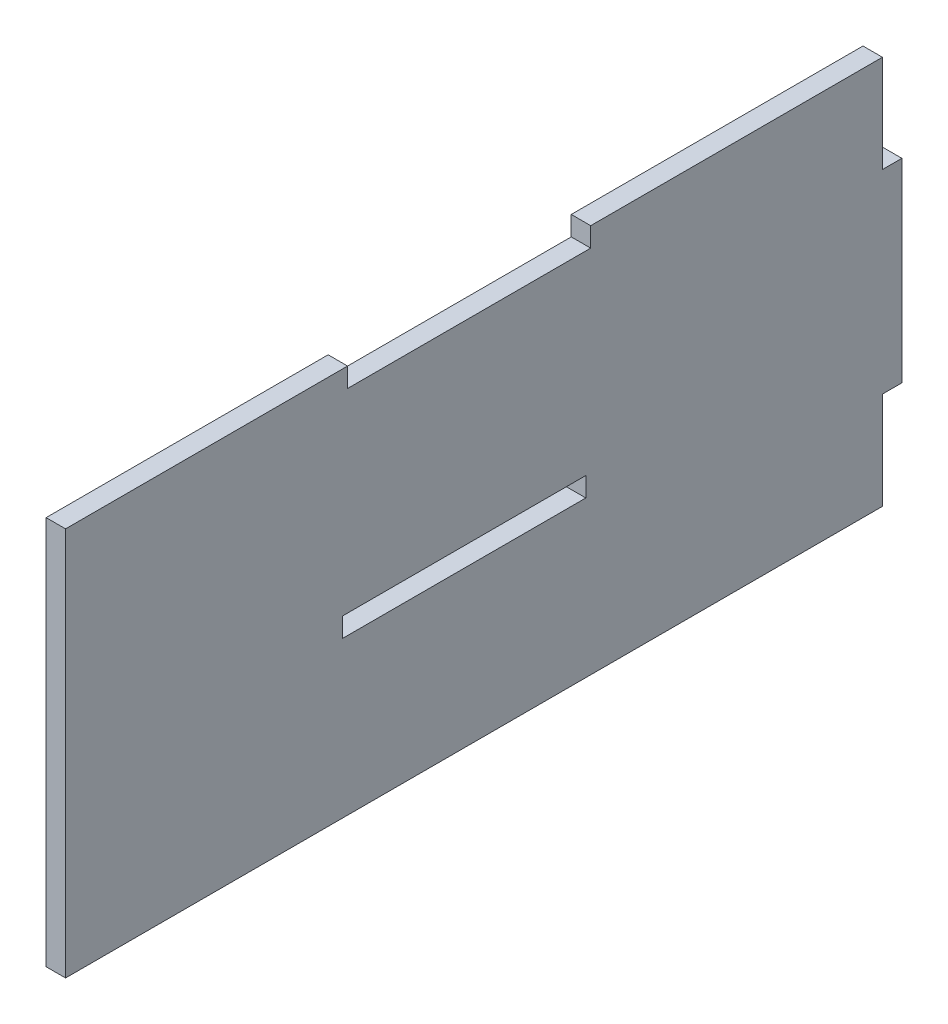
ISO-10303-21;
HEADER;
FILE_DESCRIPTION(('STEP AP214'),'2;1');
FILE_NAME('part.step','',(''),(''),'','','');
FILE_SCHEMA(('AUTOMOTIVE_DESIGN { 1 0 10303 214 1 1 1 1 }'));
ENDSEC;
DATA;
#1=APPLICATION_CONTEXT('core data for automotive mechanical design processes');
#2=APPLICATION_PROTOCOL_DEFINITION('international standard','automotive_design',2000,#1);
#3=PRODUCT_CONTEXT('',#1,'mechanical');
#4=PRODUCT('Part','Part','',(#3));
#5=PRODUCT_RELATED_PRODUCT_CATEGORY('part','',(#4));
#6=PRODUCT_DEFINITION_FORMATION('','',#4);
#7=PRODUCT_DEFINITION_CONTEXT('part definition',#1,'design');
#8=PRODUCT_DEFINITION('design','',#6,#7);
#9=PRODUCT_DEFINITION_SHAPE('','',#8);
#10=(LENGTH_UNIT() NAMED_UNIT(*) SI_UNIT(.MILLI.,.METRE.));
#11=(NAMED_UNIT(*) PLANE_ANGLE_UNIT() SI_UNIT($,.RADIAN.));
#12=(NAMED_UNIT(*) SI_UNIT($,.STERADIAN.) SOLID_ANGLE_UNIT());
#13=UNCERTAINTY_MEASURE_WITH_UNIT(LENGTH_MEASURE(1.E-05),#10,'distance_accuracy_value','');
#14=(GEOMETRIC_REPRESENTATION_CONTEXT(3) GLOBAL_UNCERTAINTY_ASSIGNED_CONTEXT((#13)) GLOBAL_UNIT_ASSIGNED_CONTEXT((#10,
#11,#12)) REPRESENTATION_CONTEXT('',''));
#15=CARTESIAN_POINT('',(0.,0.,0.));
#16=DIRECTION('',(0.,0.,1.));
#17=DIRECTION('',(1.,0.,0.));
#18=AXIS2_PLACEMENT_3D('',#15,#16,#17);
#19=CARTESIAN_POINT('',(4.,40.,87.));
#20=DIRECTION('',(0.,-1.,0.));
#21=DIRECTION('',(0.,0.,-1.));
#22=AXIS2_PLACEMENT_3D('',#19,#20,#21);
#23=PLANE('',#22);
#24=DIRECTION('',(0.,0.,1.));
#25=VECTOR('',#24,1.);
#26=CARTESIAN_POINT('',(0.,40.,87.));
#27=LINE('',#26,#25);
#28=CARTESIAN_POINT('',(0.,40.,27.));
#29=VERTEX_POINT('',#28);
#30=CARTESIAN_POINT('',(0.,40.,85.));
#31=VERTEX_POINT('',#30);
#32=EDGE_CURVE('E274',#29,#31,#27,.T.);
#33=ORIENTED_EDGE('',*,*,#32,.T.);
#34=DIRECTION('',(1.,0.,0.));
#35=VECTOR('',#34,1.);
#36=CARTESIAN_POINT('',(-6.,40.,85.));
#37=LINE('',#36,#35);
#38=CARTESIAN_POINT('',(4.,40.,85.));
#39=VERTEX_POINT('',#38);
#40=EDGE_CURVE('E195',#31,#39,#37,.T.);
#41=ORIENTED_EDGE('',*,*,#40,.T.);
#42=DIRECTION('',(0.,0.,1.));
#43=VECTOR('',#42,1.);
#44=CARTESIAN_POINT('',(4.,40.,87.));
#45=LINE('',#44,#43);
#46=CARTESIAN_POINT('',(4.,40.,27.));
#47=VERTEX_POINT('',#46);
#48=EDGE_CURVE('E266',#47,#39,#45,.T.);
#49=ORIENTED_EDGE('',*,*,#48,.F.);
#50=DIRECTION('',(1.,0.,0.));
#51=VECTOR('',#50,1.);
#52=CARTESIAN_POINT('',(0.,40.,27.));
#53=LINE('',#52,#51);
#54=EDGE_CURVE('E217',#29,#47,#53,.T.);
#55=ORIENTED_EDGE('',*,*,#54,.F.);
#56=EDGE_LOOP('',(#33,#41,#49,#55));
#57=FACE_BOUND('',#56,.T.);
#58=ADVANCED_FACE('F43',(#57),#23,.F.);
#59=CARTESIAN_POINT('',(4.,40.,-87.));
#60=DIRECTION('',(0.,0.,1.));
#61=DIRECTION('',(1.,0.,0.));
#62=AXIS2_PLACEMENT_3D('',#59,#60,#61);
#63=PLANE('',#62);
#64=DIRECTION('',(0.,1.,0.));
#65=VECTOR('',#64,1.);
#66=CARTESIAN_POINT('',(0.,40.,-87.));
#67=LINE('',#66,#65);
#68=CARTESIAN_POINT('',(0.,-20.,-87.));
#69=VERTEX_POINT('',#68);
#70=CARTESIAN_POINT('',(0.,20.,-87.));
#71=VERTEX_POINT('',#70);
#72=EDGE_CURVE('E242',#69,#71,#67,.T.);
#73=ORIENTED_EDGE('',*,*,#72,.T.);
#74=DIRECTION('',(1.,0.,0.));
#75=VECTOR('',#74,1.);
#76=CARTESIAN_POINT('',(0.,20.,-87.));
#77=LINE('',#76,#75);
#78=CARTESIAN_POINT('',(4.,20.,-87.));
#79=VERTEX_POINT('',#78);
#80=EDGE_CURVE('E239',#71,#79,#77,.T.);
#81=ORIENTED_EDGE('',*,*,#80,.T.);
#82=DIRECTION('',(0.,1.,0.));
#83=VECTOR('',#82,1.);
#84=CARTESIAN_POINT('',(4.,40.,-87.));
#85=LINE('',#84,#83);
#86=CARTESIAN_POINT('',(4.,-20.,-87.));
#87=VERTEX_POINT('',#86);
#88=EDGE_CURVE('E263',#87,#79,#85,.T.);
#89=ORIENTED_EDGE('',*,*,#88,.F.);
#90=DIRECTION('',(1.,0.,0.));
#91=VECTOR('',#90,1.);
#92=CARTESIAN_POINT('',(0.,-20.,-87.));
#93=LINE('',#92,#91);
#94=EDGE_CURVE('E246',#69,#87,#93,.T.);
#95=ORIENTED_EDGE('',*,*,#94,.F.);
#96=EDGE_LOOP('',(#73,#81,#89,#95));
#97=FACE_BOUND('',#96,.T.);
#98=ADVANCED_FACE('F45',(#97),#63,.F.);
#99=CARTESIAN_POINT('',(0.,40.,-83.));
#100=VERTEX_POINT('',#99);
#101=CARTESIAN_POINT('',(0.,40.,-23.));
#102=VERTEX_POINT('',#101);
#103=EDGE_CURVE('E275',#100,#102,#27,.T.);
#104=ORIENTED_EDGE('',*,*,#103,.T.);
#105=DIRECTION('',(1.,0.,0.));
#106=VECTOR('',#105,1.);
#107=CARTESIAN_POINT('',(0.,40.,-23.));
#108=LINE('',#107,#106);
#109=CARTESIAN_POINT('',(4.,40.,-23.));
#110=VERTEX_POINT('',#109);
#111=EDGE_CURVE('E220',#102,#110,#108,.T.);
#112=ORIENTED_EDGE('',*,*,#111,.T.);
#113=CARTESIAN_POINT('',(4.,40.,-83.));
#114=VERTEX_POINT('',#113);
#115=EDGE_CURVE('E268',#114,#110,#45,.T.);
#116=ORIENTED_EDGE('',*,*,#115,.F.);
#117=DIRECTION('',(1.,0.,0.));
#118=VECTOR('',#117,1.);
#119=CARTESIAN_POINT('',(0.,40.,-83.));
#120=LINE('',#119,#118);
#121=EDGE_CURVE('E233',#100,#114,#120,.T.);
#122=ORIENTED_EDGE('',*,*,#121,.F.);
#123=EDGE_LOOP('',(#104,#112,#116,#122));
#124=FACE_BOUND('',#123,.T.);
#125=ADVANCED_FACE('F321',(#124),#23,.F.);
#126=CARTESIAN_POINT('',(4.,-40.,87.));
#127=DIRECTION('',(0.,1.,0.));
#128=DIRECTION('',(0.,0.,1.));
#129=AXIS2_PLACEMENT_3D('',#126,#127,#128);
#130=PLANE('',#129);
#131=DIRECTION('',(0.,0.,-1.));
#132=VECTOR('',#131,1.);
#133=CARTESIAN_POINT('',(4.,-40.,87.));
#134=LINE('',#133,#132);
#135=CARTESIAN_POINT('',(4.,-40.,85.));
#136=VERTEX_POINT('',#135);
#137=CARTESIAN_POINT('',(4.,-40.,-83.));
#138=VERTEX_POINT('',#137);
#139=EDGE_CURVE('E51',#136,#138,#134,.T.);
#140=ORIENTED_EDGE('',*,*,#139,.F.);
#141=DIRECTION('',(1.,0.,0.));
#142=VECTOR('',#141,1.);
#143=CARTESIAN_POINT('',(-6.,-40.,85.));
#144=LINE('',#143,#142);
#145=CARTESIAN_POINT('',(0.,-40.,85.));
#146=VERTEX_POINT('',#145);
#147=EDGE_CURVE('E194',#146,#136,#144,.T.);
#148=ORIENTED_EDGE('',*,*,#147,.F.);
#149=DIRECTION('',(0.,0.,-1.));
#150=VECTOR('',#149,1.);
#151=CARTESIAN_POINT('',(0.,-40.,87.));
#152=LINE('',#151,#150);
#153=CARTESIAN_POINT('',(0.,-40.,-83.));
#154=VERTEX_POINT('',#153);
#155=EDGE_CURVE('E267',#146,#154,#152,.T.);
#156=ORIENTED_EDGE('',*,*,#155,.T.);
#157=DIRECTION('',(1.,0.,0.));
#158=VECTOR('',#157,1.);
#159=CARTESIAN_POINT('',(0.,-40.,-83.));
#160=LINE('',#159,#158);
#161=EDGE_CURVE('E219',#154,#138,#160,.T.);
#162=ORIENTED_EDGE('',*,*,#161,.T.);
#163=EDGE_LOOP('',(#140,#148,#156,#162));
#164=FACE_BOUND('',#163,.T.);
#165=ADVANCED_FACE('F282',(#164),#130,.F.);
#166=CARTESIAN_POINT('',(4.,0.,0.));
#167=DIRECTION('',(1.,0.,0.));
#168=DIRECTION('',(0.,0.,-1.));
#169=AXIS2_PLACEMENT_3D('',#166,#167,#168);
#170=PLANE('',#169);
#171=DIRECTION('',(0.,-1.,0.));
#172=VECTOR('',#171,1.);
#173=CARTESIAN_POINT('',(4.,-4.,28.));
#174=LINE('',#173,#172);
#175=CARTESIAN_POINT('',(4.,-4.,28.));
#176=VERTEX_POINT('',#175);
#177=CARTESIAN_POINT('',(4.,-8.,28.));
#178=VERTEX_POINT('',#177);
#179=EDGE_CURVE('E58',#176,#178,#174,.T.);
#180=ORIENTED_EDGE('',*,*,#179,.F.);
#181=DIRECTION('',(0.,0.,1.));
#182=VECTOR('',#181,1.);
#183=CARTESIAN_POINT('',(4.,-4.,28.));
#184=LINE('',#183,#182);
#185=CARTESIAN_POINT('',(4.,-4.,-22.));
#186=VERTEX_POINT('',#185);
#187=EDGE_CURVE('E174',#186,#176,#184,.T.);
#188=ORIENTED_EDGE('',*,*,#187,.F.);
#189=DIRECTION('',(0.,1.,0.));
#190=VECTOR('',#189,1.);
#191=CARTESIAN_POINT('',(4.,-4.,-22.));
#192=LINE('',#191,#190);
#193=CARTESIAN_POINT('',(4.,-8.,-22.));
#194=VERTEX_POINT('',#193);
#195=EDGE_CURVE('E177',#194,#186,#192,.T.);
#196=ORIENTED_EDGE('',*,*,#195,.F.);
#197=DIRECTION('',(0.,0.,-1.));
#198=VECTOR('',#197,1.);
#199=CARTESIAN_POINT('',(4.,-8.,28.));
#200=LINE('',#199,#198);
#201=EDGE_CURVE('E183',#178,#194,#200,.T.);
#202=ORIENTED_EDGE('',*,*,#201,.F.);
#203=EDGE_LOOP('',(#180,#188,#196,#202));
#204=FACE_BOUND('',#203,.T.);
#205=DIRECTION('',(0.,1.,0.));
#206=VECTOR('',#205,1.);
#207=CARTESIAN_POINT('',(4.,40.,85.));
#208=LINE('',#207,#206);
#209=EDGE_CURVE('E189',#136,#39,#208,.T.);
#210=ORIENTED_EDGE('',*,*,#209,.F.);
#211=ORIENTED_EDGE('',*,*,#139,.T.);
#212=DIRECTION('',(0.,-1.,0.));
#213=VECTOR('',#212,1.);
#214=CARTESIAN_POINT('',(4.,-40.,-83.));
#215=LINE('',#214,#213);
#216=CARTESIAN_POINT('',(4.,-20.,-83.));
#217=VERTEX_POINT('',#216);
#218=EDGE_CURVE('E253',#217,#138,#215,.T.);
#219=ORIENTED_EDGE('',*,*,#218,.F.);
#220=DIRECTION('',(0.,0.,1.));
#221=VECTOR('',#220,1.);
#222=CARTESIAN_POINT('',(4.,-20.,-87.));
#223=LINE('',#222,#221);
#224=EDGE_CURVE('E237',#87,#217,#223,.T.);
#225=ORIENTED_EDGE('',*,*,#224,.F.);
#226=ORIENTED_EDGE('',*,*,#88,.T.);
#227=DIRECTION('',(0.,0.,-1.));
#228=VECTOR('',#227,1.);
#229=CARTESIAN_POINT('',(4.,20.,-87.));
#230=LINE('',#229,#228);
#231=CARTESIAN_POINT('',(4.,20.,-83.));
#232=VERTEX_POINT('',#231);
#233=EDGE_CURVE('E230',#232,#79,#230,.T.);
#234=ORIENTED_EDGE('',*,*,#233,.F.);
#235=DIRECTION('',(0.,-1.,0.));
#236=VECTOR('',#235,1.);
#237=CARTESIAN_POINT('',(4.,40.,-83.));
#238=LINE('',#237,#236);
#239=EDGE_CURVE('E234',#114,#232,#238,.T.);
#240=ORIENTED_EDGE('',*,*,#239,.F.);
#241=ORIENTED_EDGE('',*,*,#115,.T.);
#242=DIRECTION('',(0.,1.,0.));
#243=VECTOR('',#242,1.);
#244=CARTESIAN_POINT('',(4.,40.,-23.));
#245=LINE('',#244,#243);
#246=CARTESIAN_POINT('',(4.,36.,-23.));
#247=VERTEX_POINT('',#246);
#248=EDGE_CURVE('E204',#247,#110,#245,.T.);
#249=ORIENTED_EDGE('',*,*,#248,.F.);
#250=DIRECTION('',(0.,0.,-1.));
#251=VECTOR('',#250,1.);
#252=CARTESIAN_POINT('',(4.,36.,27.));
#253=LINE('',#252,#251);
#254=CARTESIAN_POINT('',(4.,36.,27.));
#255=VERTEX_POINT('',#254);
#256=EDGE_CURVE('E213',#255,#247,#253,.T.);
#257=ORIENTED_EDGE('',*,*,#256,.F.);
#258=DIRECTION('',(0.,-1.,0.));
#259=VECTOR('',#258,1.);
#260=CARTESIAN_POINT('',(4.,40.,27.));
#261=LINE('',#260,#259);
#262=EDGE_CURVE('E198',#47,#255,#261,.T.);
#263=ORIENTED_EDGE('',*,*,#262,.F.);
#264=ORIENTED_EDGE('',*,*,#48,.T.);
#265=EDGE_LOOP('',(#210,#211,#219,#225,#226,#234,#240,#241,#249,#257,#263,#264));
#266=FACE_BOUND('',#265,.T.);
#267=ADVANCED_FACE('F297',(#204,#266),#170,.T.);
#268=CARTESIAN_POINT('',(0.,0.,0.));
#269=DIRECTION('',(1.,0.,0.));
#270=DIRECTION('',(0.,0.,-1.));
#271=AXIS2_PLACEMENT_3D('',#268,#269,#270);
#272=PLANE('',#271);
#273=DIRECTION('',(0.,0.,1.));
#274=VECTOR('',#273,1.);
#275=CARTESIAN_POINT('',(0.,-4.,28.));
#276=LINE('',#275,#274);
#277=CARTESIAN_POINT('',(0.,-4.,-22.));
#278=VERTEX_POINT('',#277);
#279=CARTESIAN_POINT('',(0.,-4.,28.));
#280=VERTEX_POINT('',#279);
#281=EDGE_CURVE('E164',#278,#280,#276,.T.);
#282=ORIENTED_EDGE('',*,*,#281,.T.);
#283=DIRECTION('',(0.,-1.,0.));
#284=VECTOR('',#283,1.);
#285=CARTESIAN_POINT('',(0.,-4.,28.));
#286=LINE('',#285,#284);
#287=CARTESIAN_POINT('',(0.,-8.,28.));
#288=VERTEX_POINT('',#287);
#289=EDGE_CURVE('E158',#280,#288,#286,.T.);
#290=ORIENTED_EDGE('',*,*,#289,.T.);
#291=DIRECTION('',(0.,0.,-1.));
#292=VECTOR('',#291,1.);
#293=CARTESIAN_POINT('',(0.,-8.,28.));
#294=LINE('',#293,#292);
#295=CARTESIAN_POINT('',(0.,-8.,-22.));
#296=VERTEX_POINT('',#295);
#297=EDGE_CURVE('E167',#288,#296,#294,.T.);
#298=ORIENTED_EDGE('',*,*,#297,.T.);
#299=DIRECTION('',(0.,1.,0.));
#300=VECTOR('',#299,1.);
#301=CARTESIAN_POINT('',(0.,-4.,-22.));
#302=LINE('',#301,#300);
#303=EDGE_CURVE('E66',#296,#278,#302,.T.);
#304=ORIENTED_EDGE('',*,*,#303,.T.);
#305=EDGE_LOOP('',(#282,#290,#298,#304));
#306=FACE_BOUND('',#305,.T.);
#307=ORIENTED_EDGE('',*,*,#155,.F.);
#308=DIRECTION('',(0.,1.,0.));
#309=VECTOR('',#308,1.);
#310=CARTESIAN_POINT('',(0.,0.,85.));
#311=LINE('',#310,#309);
#312=EDGE_CURVE('E11',#146,#31,#311,.T.);
#313=ORIENTED_EDGE('',*,*,#312,.T.);
#314=ORIENTED_EDGE('',*,*,#32,.F.);
#315=DIRECTION('',(0.,-1.,0.));
#316=VECTOR('',#315,1.);
#317=CARTESIAN_POINT('',(0.,40.,27.));
#318=LINE('',#317,#316);
#319=CARTESIAN_POINT('',(0.,36.,27.));
#320=VERTEX_POINT('',#319);
#321=EDGE_CURVE('E200',#29,#320,#318,.T.);
#322=ORIENTED_EDGE('',*,*,#321,.T.);
#323=DIRECTION('',(0.,0.,-1.));
#324=VECTOR('',#323,1.);
#325=CARTESIAN_POINT('',(0.,36.,27.));
#326=LINE('',#325,#324);
#327=CARTESIAN_POINT('',(0.,36.,-23.));
#328=VERTEX_POINT('',#327);
#329=EDGE_CURVE('E203',#320,#328,#326,.T.);
#330=ORIENTED_EDGE('',*,*,#329,.T.);
#331=DIRECTION('',(0.,1.,0.));
#332=VECTOR('',#331,1.);
#333=CARTESIAN_POINT('',(0.,40.,-23.));
#334=LINE('',#333,#332);
#335=EDGE_CURVE('E207',#328,#102,#334,.T.);
#336=ORIENTED_EDGE('',*,*,#335,.T.);
#337=ORIENTED_EDGE('',*,*,#103,.F.);
#338=DIRECTION('',(0.,-1.,0.));
#339=VECTOR('',#338,1.);
#340=CARTESIAN_POINT('',(0.,40.,-83.));
#341=LINE('',#340,#339);
#342=CARTESIAN_POINT('',(0.,20.,-83.));
#343=VERTEX_POINT('',#342);
#344=EDGE_CURVE('E226',#100,#343,#341,.T.);
#345=ORIENTED_EDGE('',*,*,#344,.T.);
#346=DIRECTION('',(0.,0.,-1.));
#347=VECTOR('',#346,1.);
#348=CARTESIAN_POINT('',(0.,20.,-87.));
#349=LINE('',#348,#347);
#350=EDGE_CURVE('E229',#343,#71,#349,.T.);
#351=ORIENTED_EDGE('',*,*,#350,.T.);
#352=ORIENTED_EDGE('',*,*,#72,.F.);
#353=DIRECTION('',(0.,0.,1.));
#354=VECTOR('',#353,1.);
#355=CARTESIAN_POINT('',(0.,-20.,-87.));
#356=LINE('',#355,#354);
#357=CARTESIAN_POINT('',(0.,-20.,-83.));
#358=VERTEX_POINT('',#357);
#359=EDGE_CURVE('E256',#69,#358,#356,.T.);
#360=ORIENTED_EDGE('',*,*,#359,.T.);
#361=DIRECTION('',(0.,-1.,0.));
#362=VECTOR('',#361,1.);
#363=CARTESIAN_POINT('',(0.,-40.,-83.));
#364=LINE('',#363,#362);
#365=EDGE_CURVE('E248',#358,#154,#364,.T.);
#366=ORIENTED_EDGE('',*,*,#365,.T.);
#367=EDGE_LOOP('',(#307,#313,#314,#322,#330,#336,#337,#345,#351,#352,#360,#366));
#368=FACE_BOUND('',#367,.T.);
#369=ADVANCED_FACE('F171',(#306,#368),#272,.F.);
#370=CARTESIAN_POINT('',(0.,-40.,-83.));
#371=DIRECTION('',(0.,0.,1.));
#372=DIRECTION('',(1.,0.,0.));
#373=AXIS2_PLACEMENT_3D('',#370,#371,#372);
#374=PLANE('',#373);
#375=ORIENTED_EDGE('',*,*,#218,.T.);
#376=ORIENTED_EDGE('',*,*,#161,.F.);
#377=ORIENTED_EDGE('',*,*,#365,.F.);
#378=DIRECTION('',(1.,0.,0.));
#379=VECTOR('',#378,1.);
#380=CARTESIAN_POINT('',(0.,-20.,-83.));
#381=LINE('',#380,#379);
#382=EDGE_CURVE('E249',#358,#217,#381,.T.);
#383=ORIENTED_EDGE('',*,*,#382,.T.);
#384=EDGE_LOOP('',(#375,#376,#377,#383));
#385=FACE_BOUND('',#384,.T.);
#386=ADVANCED_FACE('F284',(#385),#374,.F.);
#387=CARTESIAN_POINT('',(0.,-20.,-87.));
#388=DIRECTION('',(0.,1.,0.));
#389=DIRECTION('',(0.,0.,1.));
#390=AXIS2_PLACEMENT_3D('',#387,#388,#389);
#391=PLANE('',#390);
#392=ORIENTED_EDGE('',*,*,#224,.T.);
#393=ORIENTED_EDGE('',*,*,#382,.F.);
#394=ORIENTED_EDGE('',*,*,#359,.F.);
#395=ORIENTED_EDGE('',*,*,#94,.T.);
#396=EDGE_LOOP('',(#392,#393,#394,#395));
#397=FACE_BOUND('',#396,.T.);
#398=ADVANCED_FACE('F290',(#397),#391,.F.);
#399=CARTESIAN_POINT('',(0.,20.,-87.));
#400=DIRECTION('',(0.,-1.,0.));
#401=DIRECTION('',(0.,0.,-1.));
#402=AXIS2_PLACEMENT_3D('',#399,#400,#401);
#403=PLANE('',#402);
#404=ORIENTED_EDGE('',*,*,#233,.T.);
#405=ORIENTED_EDGE('',*,*,#80,.F.);
#406=ORIENTED_EDGE('',*,*,#350,.F.);
#407=DIRECTION('',(1.,0.,0.));
#408=VECTOR('',#407,1.);
#409=CARTESIAN_POINT('',(0.,20.,-83.));
#410=LINE('',#409,#408);
#411=EDGE_CURVE('E243',#343,#232,#410,.T.);
#412=ORIENTED_EDGE('',*,*,#411,.T.);
#413=EDGE_LOOP('',(#404,#405,#406,#412));
#414=FACE_BOUND('',#413,.T.);
#415=ADVANCED_FACE('F327',(#414),#403,.F.);
#416=CARTESIAN_POINT('',(0.,40.,-83.));
#417=DIRECTION('',(0.,0.,1.));
#418=DIRECTION('',(1.,0.,0.));
#419=AXIS2_PLACEMENT_3D('',#416,#417,#418);
#420=PLANE('',#419);
#421=ORIENTED_EDGE('',*,*,#239,.T.);
#422=ORIENTED_EDGE('',*,*,#411,.F.);
#423=ORIENTED_EDGE('',*,*,#344,.F.);
#424=ORIENTED_EDGE('',*,*,#121,.T.);
#425=EDGE_LOOP('',(#421,#422,#423,#424));
#426=FACE_BOUND('',#425,.T.);
#427=ADVANCED_FACE('F324',(#426),#420,.F.);
#428=CARTESIAN_POINT('',(0.,40.,27.));
#429=DIRECTION('',(0.,0.,1.));
#430=DIRECTION('',(1.,0.,0.));
#431=AXIS2_PLACEMENT_3D('',#428,#429,#430);
#432=PLANE('',#431);
#433=ORIENTED_EDGE('',*,*,#262,.T.);
#434=DIRECTION('',(1.,0.,0.));
#435=VECTOR('',#434,1.);
#436=CARTESIAN_POINT('',(0.,36.,27.));
#437=LINE('',#436,#435);
#438=EDGE_CURVE('E210',#320,#255,#437,.T.);
#439=ORIENTED_EDGE('',*,*,#438,.F.);
#440=ORIENTED_EDGE('',*,*,#321,.F.);
#441=ORIENTED_EDGE('',*,*,#54,.T.);
#442=EDGE_LOOP('',(#433,#439,#440,#441));
#443=FACE_BOUND('',#442,.T.);
#444=ADVANCED_FACE('F310',(#443),#432,.F.);
#445=CARTESIAN_POINT('',(0.,40.,-23.));
#446=DIRECTION('',(0.,0.,-1.));
#447=DIRECTION('',(-1.,0.,0.));
#448=AXIS2_PLACEMENT_3D('',#445,#446,#447);
#449=PLANE('',#448);
#450=ORIENTED_EDGE('',*,*,#248,.T.);
#451=ORIENTED_EDGE('',*,*,#111,.F.);
#452=ORIENTED_EDGE('',*,*,#335,.F.);
#453=DIRECTION('',(1.,0.,0.));
#454=VECTOR('',#453,1.);
#455=CARTESIAN_POINT('',(0.,36.,-23.));
#456=LINE('',#455,#454);
#457=EDGE_CURVE('E223',#328,#247,#456,.T.);
#458=ORIENTED_EDGE('',*,*,#457,.T.);
#459=EDGE_LOOP('',(#450,#451,#452,#458));
#460=FACE_BOUND('',#459,.T.);
#461=ADVANCED_FACE('F317',(#460),#449,.F.);
#462=CARTESIAN_POINT('',(0.,36.,27.));
#463=DIRECTION('',(0.,-1.,0.));
#464=DIRECTION('',(0.,0.,-1.));
#465=AXIS2_PLACEMENT_3D('',#462,#463,#464);
#466=PLANE('',#465);
#467=ORIENTED_EDGE('',*,*,#256,.T.);
#468=ORIENTED_EDGE('',*,*,#457,.F.);
#469=ORIENTED_EDGE('',*,*,#329,.F.);
#470=ORIENTED_EDGE('',*,*,#438,.T.);
#471=EDGE_LOOP('',(#467,#468,#469,#470));
#472=FACE_BOUND('',#471,.T.);
#473=ADVANCED_FACE('F314',(#472),#466,.F.);
#474=CARTESIAN_POINT('',(-6.,40.,85.));
#475=DIRECTION('',(0.,0.,-1.));
#476=DIRECTION('',(-1.,0.,0.));
#477=AXIS2_PLACEMENT_3D('',#474,#475,#476);
#478=PLANE('',#477);
#479=ORIENTED_EDGE('',*,*,#147,.T.);
#480=ORIENTED_EDGE('',*,*,#209,.T.);
#481=ORIENTED_EDGE('',*,*,#40,.F.);
#482=ORIENTED_EDGE('',*,*,#312,.F.);
#483=EDGE_LOOP('',(#479,#480,#481,#482));
#484=FACE_BOUND('',#483,.T.);
#485=ADVANCED_FACE('F303',(#484),#478,.F.);
#486=CARTESIAN_POINT('',(0.,-4.,28.));
#487=DIRECTION('',(0.,0.,1.));
#488=DIRECTION('',(1.,0.,0.));
#489=AXIS2_PLACEMENT_3D('',#486,#487,#488);
#490=PLANE('',#489);
#491=ORIENTED_EDGE('',*,*,#179,.T.);
#492=DIRECTION('',(1.,0.,0.));
#493=VECTOR('',#492,1.);
#494=CARTESIAN_POINT('',(0.,-8.,28.));
#495=LINE('',#494,#493);
#496=EDGE_CURVE('E154',#288,#178,#495,.T.);
#497=ORIENTED_EDGE('',*,*,#496,.F.);
#498=ORIENTED_EDGE('',*,*,#289,.F.);
#499=DIRECTION('',(1.,0.,0.));
#500=VECTOR('',#499,1.);
#501=CARTESIAN_POINT('',(0.,-4.,28.));
#502=LINE('',#501,#500);
#503=EDGE_CURVE('E187',#280,#176,#502,.T.);
#504=ORIENTED_EDGE('',*,*,#503,.T.);
#505=EDGE_LOOP('',(#491,#497,#498,#504));
#506=FACE_BOUND('',#505,.T.);
#507=ADVANCED_FACE('F156',(#506),#490,.F.);
#508=CARTESIAN_POINT('',(0.,-4.,28.));
#509=DIRECTION('',(0.,1.,0.));
#510=DIRECTION('',(0.,0.,1.));
#511=AXIS2_PLACEMENT_3D('',#508,#509,#510);
#512=PLANE('',#511);
#513=ORIENTED_EDGE('',*,*,#187,.T.);
#514=ORIENTED_EDGE('',*,*,#503,.F.);
#515=ORIENTED_EDGE('',*,*,#281,.F.);
#516=DIRECTION('',(1.,0.,0.));
#517=VECTOR('',#516,1.);
#518=CARTESIAN_POINT('',(0.,-4.,-22.));
#519=LINE('',#518,#517);
#520=EDGE_CURVE('E190',#278,#186,#519,.T.);
#521=ORIENTED_EDGE('',*,*,#520,.T.);
#522=EDGE_LOOP('',(#513,#514,#515,#521));
#523=FACE_BOUND('',#522,.T.);
#524=ADVANCED_FACE('F427',(#523),#512,.F.);
#525=CARTESIAN_POINT('',(0.,-4.,-22.));
#526=DIRECTION('',(0.,0.,-1.));
#527=DIRECTION('',(-1.,0.,0.));
#528=AXIS2_PLACEMENT_3D('',#525,#526,#527);
#529=PLANE('',#528);
#530=ORIENTED_EDGE('',*,*,#195,.T.);
#531=ORIENTED_EDGE('',*,*,#520,.F.);
#532=ORIENTED_EDGE('',*,*,#303,.F.);
#533=DIRECTION('',(1.,0.,0.));
#534=VECTOR('',#533,1.);
#535=CARTESIAN_POINT('',(0.,-8.,-22.));
#536=LINE('',#535,#534);
#537=EDGE_CURVE('E163',#296,#194,#536,.T.);
#538=ORIENTED_EDGE('',*,*,#537,.T.);
#539=EDGE_LOOP('',(#530,#531,#532,#538));
#540=FACE_BOUND('',#539,.T.);
#541=ADVANCED_FACE('F434',(#540),#529,.F.);
#542=CARTESIAN_POINT('',(0.,-8.,28.));
#543=DIRECTION('',(0.,-1.,0.));
#544=DIRECTION('',(0.,0.,-1.));
#545=AXIS2_PLACEMENT_3D('',#542,#543,#544);
#546=PLANE('',#545);
#547=ORIENTED_EDGE('',*,*,#201,.T.);
#548=ORIENTED_EDGE('',*,*,#537,.F.);
#549=ORIENTED_EDGE('',*,*,#297,.F.);
#550=ORIENTED_EDGE('',*,*,#496,.T.);
#551=EDGE_LOOP('',(#547,#548,#549,#550));
#552=FACE_BOUND('',#551,.T.);
#553=ADVANCED_FACE('F168',(#552),#546,.F.);
#554=CLOSED_SHELL('',(#58,#98,#125,#165,#267,#369,#386,#398,#415,#427,#444,#461,#473,#485,#507,
#524,#541,#553));
#555=MANIFOLD_SOLID_BREP('B2',#554);
#556=ADVANCED_BREP_SHAPE_REPRESENTATION('',(#18,#555),#14);
#557=SHAPE_DEFINITION_REPRESENTATION(#9,#556);
ENDSEC;
END-ISO-10303-21;
